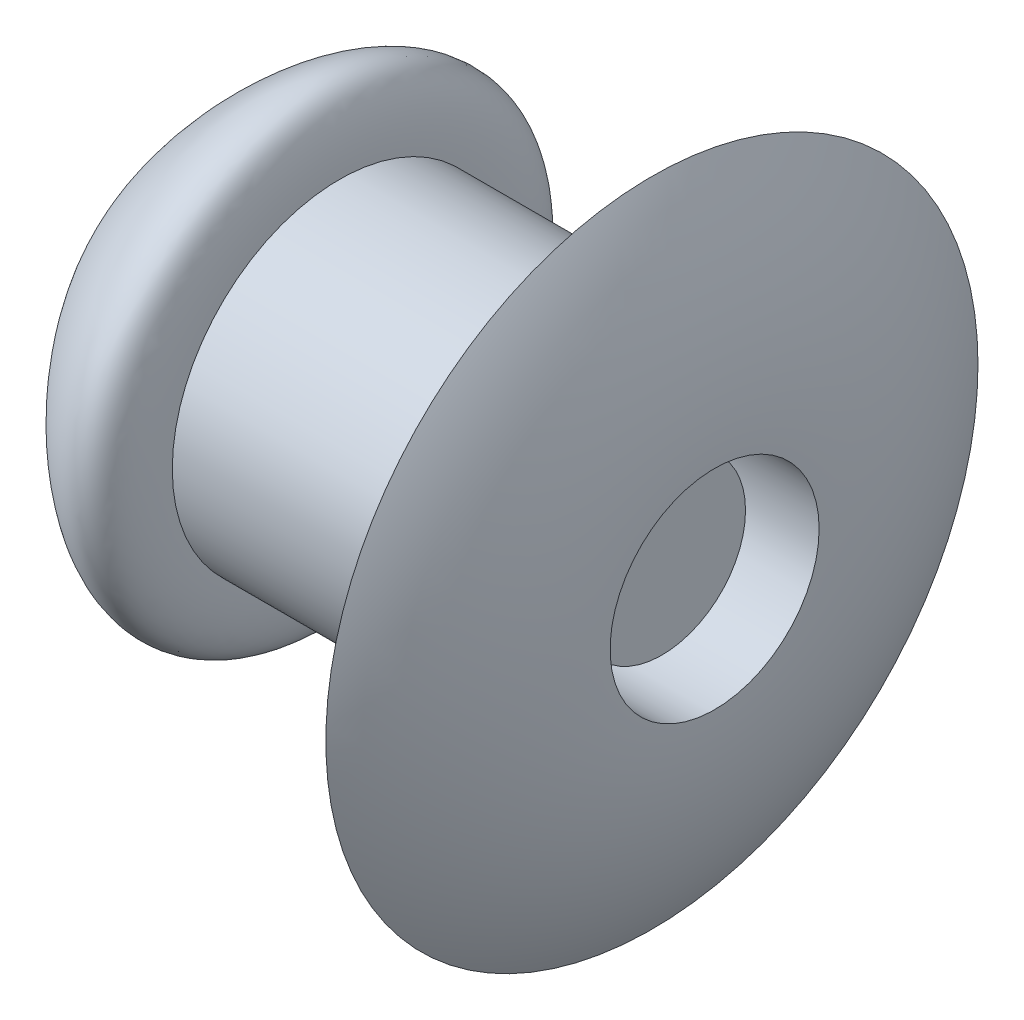
ISO-10303-21;
HEADER;
FILE_DESCRIPTION(('STEP AP214'),'2;1');
FILE_NAME('part.step','',(''),(''),'','','');
FILE_SCHEMA(('AUTOMOTIVE_DESIGN { 1 0 10303 214 1 1 1 1 }'));
ENDSEC;
DATA;
#1=APPLICATION_CONTEXT('core data for automotive mechanical design processes');
#2=APPLICATION_PROTOCOL_DEFINITION('international standard','automotive_design',2000,#1);
#3=PRODUCT_CONTEXT('',#1,'mechanical');
#4=PRODUCT('Part','Part','',(#3));
#5=PRODUCT_RELATED_PRODUCT_CATEGORY('part','',(#4));
#6=PRODUCT_DEFINITION_FORMATION('','',#4);
#7=PRODUCT_DEFINITION_CONTEXT('part definition',#1,'design');
#8=PRODUCT_DEFINITION('design','',#6,#7);
#9=PRODUCT_DEFINITION_SHAPE('','',#8);
#10=(LENGTH_UNIT() NAMED_UNIT(*) SI_UNIT(.MILLI.,.METRE.));
#11=(NAMED_UNIT(*) PLANE_ANGLE_UNIT() SI_UNIT($,.RADIAN.));
#12=(NAMED_UNIT(*) SI_UNIT($,.STERADIAN.) SOLID_ANGLE_UNIT());
#13=UNCERTAINTY_MEASURE_WITH_UNIT(LENGTH_MEASURE(1.E-05),#10,'distance_accuracy_value','');
#14=(GEOMETRIC_REPRESENTATION_CONTEXT(3) GLOBAL_UNCERTAINTY_ASSIGNED_CONTEXT((#13)) GLOBAL_UNIT_ASSIGNED_CONTEXT((#10,
#11,#12)) REPRESENTATION_CONTEXT('',''));
#15=CARTESIAN_POINT('',(0.,0.,0.));
#16=DIRECTION('',(0.,0.,1.));
#17=DIRECTION('',(1.,0.,0.));
#18=AXIS2_PLACEMENT_3D('',#15,#16,#17);
#19=CARTESIAN_POINT('',(346.429933333335,893.681551629297,0.));
#20=DIRECTION('',(1.,0.,0.));
#21=DIRECTION('',(0.,0.,-1.));
#22=AXIS2_PLACEMENT_3D('',#19,#20,#21);
#23=DEGENERATE_TOROIDAL_SURFACE('',#22,1.24999999999997,5.05666666666693,.T.);
#24=CARTESIAN_POINT('',(350.736600000001,893.681551629297,0.));
#25=DIRECTION('',(1.,0.,0.));
#26=DIRECTION('',(0.,0.,-1.));
#27=AXIS2_PLACEMENT_3D('',#24,#25,#26);
#28=CIRCLE('',#27,3.90000000000001);
#29=CARTESIAN_POINT('',(350.736600000001,893.681551629297,-3.90000000000001));
#30=VERTEX_POINT('',#29);
#31=EDGE_CURVE('E11',#30,#30,#28,.T.);
#32=ORIENTED_EDGE('',*,*,#31,.T.);
#33=EDGE_LOOP('',(#32));
#34=FACE_BOUND('',#33,.T.);
#35=CARTESIAN_POINT('',(351.486600000001,893.681551629297,0.));
#36=DIRECTION('',(1.,0.,0.));
#37=DIRECTION('',(0.,0.,-1.));
#38=AXIS2_PLACEMENT_3D('',#35,#36,#37);
#39=CIRCLE('',#38,1.24999999999997);
#40=CARTESIAN_POINT('',(351.486600000001,893.681551629297,-1.24999999999997));
#41=VERTEX_POINT('',#40);
#42=EDGE_CURVE('E84',#41,#41,#39,.T.);
#43=ORIENTED_EDGE('',*,*,#42,.F.);
#44=EDGE_LOOP('',(#43));
#45=FACE_BOUND('',#44,.T.);
#46=ADVANCED_FACE('F33',(#34,#45),#23,.T.);
#47=CARTESIAN_POINT('',(350.736600000001,897.581551629297,0.));
#48=DIRECTION('',(-1.,0.,0.));
#49=DIRECTION('',(0.,0.,1.));
#50=AXIS2_PLACEMENT_3D('',#47,#48,#49);
#51=PLANE('',#50);
#52=CARTESIAN_POINT('',(350.736600000001,893.681551629297,0.));
#53=DIRECTION('',(1.,0.,0.));
#54=DIRECTION('',(0.,0.,-1.));
#55=AXIS2_PLACEMENT_3D('',#52,#53,#54);
#56=CIRCLE('',#55,2.);
#57=CARTESIAN_POINT('',(350.736600000001,893.681551629297,-2.));
#58=VERTEX_POINT('',#57);
#59=EDGE_CURVE('E39',#58,#58,#56,.T.);
#60=ORIENTED_EDGE('',*,*,#59,.T.);
#61=EDGE_LOOP('',(#60));
#62=FACE_BOUND('',#61,.T.);
#63=ORIENTED_EDGE('',*,*,#31,.F.);
#64=EDGE_LOOP('',(#63));
#65=FACE_BOUND('',#64,.T.);
#66=ADVANCED_FACE('F64',(#62,#65),#51,.T.);
#67=CARTESIAN_POINT('',(350.856147885125,893.681551629297,0.));
#68=DIRECTION('',(1.,0.,0.));
#69=DIRECTION('',(0.,0.,-1.));
#70=AXIS2_PLACEMENT_3D('',#67,#68,#69);
#71=CYLINDRICAL_SURFACE('',#70,2.);
#72=CARTESIAN_POINT('',(347.000000013712,893.681551629297,0.));
#73=DIRECTION('',(1.,0.,0.));
#74=DIRECTION('',(0.,0.,-1.));
#75=AXIS2_PLACEMENT_3D('',#72,#73,#74);
#76=CIRCLE('',#75,2.);
#77=CARTESIAN_POINT('',(347.000000013712,893.681551629297,-2.));
#78=VERTEX_POINT('',#77);
#79=EDGE_CURVE('E52',#78,#78,#76,.T.);
#80=ORIENTED_EDGE('',*,*,#79,.T.);
#81=EDGE_LOOP('',(#80));
#82=FACE_BOUND('',#81,.T.);
#83=ORIENTED_EDGE('',*,*,#59,.F.);
#84=EDGE_LOOP('',(#83));
#85=FACE_BOUND('',#84,.T.);
#86=ADVANCED_FACE('F67',(#82,#85),#71,.T.);
#87=CARTESIAN_POINT('',(347.000000013712,895.681551629297,0.));
#88=CARTESIAN_POINT('',(347.036555423588,898.021351685394,0.));
#89=CARTESIAN_POINT('',(343.536594651749,893.309377004903,0.));
#90=CARTESIAN_POINT('',(345.758684651456,895.170148193983,0.));
#91=CARTESIAN_POINT('',(346.055380649424,894.856511413385,0.));
#92=B_SPLINE_CURVE_WITH_KNOTS('',3,(#87,#88,#89,#90,#91),.UNSPECIFIED.,.F.,.F.,(4,1,4),(0.,
0.744501965187623,1.),.UNSPECIFIED.);
#93=CARTESIAN_POINT('',(350.856147885125,893.681551629297,0.));
#94=DIRECTION('',(1.,0.,0.));
#95=AXIS1_PLACEMENT('',#93,#94);
#96=SURFACE_OF_REVOLUTION('',#92,#95);
#97=CARTESIAN_POINT('',(346.055380649424,893.681551629297,0.));
#98=DIRECTION('',(1.,0.,0.));
#99=DIRECTION('',(0.,0.,-1.));
#100=AXIS2_PLACEMENT_3D('',#97,#98,#99);
#101=CIRCLE('',#100,1.17495978408733);
#102=CARTESIAN_POINT('',(346.055380649424,893.681551629297,-1.17495978408733));
#103=VERTEX_POINT('',#102);
#104=EDGE_CURVE('E50',#103,#103,#101,.T.);
#105=ORIENTED_EDGE('',*,*,#104,.T.);
#106=EDGE_LOOP('',(#105));
#107=FACE_BOUND('',#106,.T.);
#108=ORIENTED_EDGE('',*,*,#79,.F.);
#109=EDGE_LOOP('',(#108));
#110=FACE_BOUND('',#109,.T.);
#111=ADVANCED_FACE('F46',(#107,#110),#96,.F.);
#112=CARTESIAN_POINT('',(346.055380649424,894.856511413385,0.));
#113=CARTESIAN_POINT('',(345.173909167695,894.872028364683,0.));
#114=CARTESIAN_POINT('',(345.400000000001,893.681551629297,0.));
#115=B_SPLINE_CURVE_WITH_KNOTS('',2,(#112,#113,#114),.UNSPECIFIED.,.F.,.F.,(3,3),(0.,1.),.UNSPECIFIED.);
#116=CARTESIAN_POINT('',(350.856147885125,893.681551629297,0.));
#117=DIRECTION('',(1.,0.,0.));
#118=AXIS1_PLACEMENT('',#116,#117);
#119=SURFACE_OF_REVOLUTION('',#115,#118);
#120=CARTESIAN_POINT('',(345.400000000001,893.681551629297,0.));
#121=VERTEX_POINT('',#120);
#122=VERTEX_LOOP('',#121);
#123=FACE_BOUND('',#122,.T.);
#124=ORIENTED_EDGE('',*,*,#104,.F.);
#125=EDGE_LOOP('',(#124));
#126=FACE_BOUND('',#125,.T.);
#127=ADVANCED_FACE('F42',(#123,#126),#119,.F.);
#128=CARTESIAN_POINT('',(350.856147885125,894.681551629297,0.));
#129=DIRECTION('',(1.,0.,0.));
#130=DIRECTION('',(0.,0.,-1.));
#131=AXIS2_PLACEMENT_3D('',#128,#129,#130);
#132=PLANE('',#131);
#133=CARTESIAN_POINT('',(350.856147885125,893.681551629297,0.));
#134=DIRECTION('',(1.,0.,0.));
#135=DIRECTION('',(0.,0.,-1.));
#136=AXIS2_PLACEMENT_3D('',#133,#134,#135);
#137=CIRCLE('',#136,0.99999999999989);
#138=CARTESIAN_POINT('',(350.856147885125,893.681551629297,-0.99999999999989));
#139=VERTEX_POINT('',#138);
#140=EDGE_CURVE('E53',#139,#139,#137,.T.);
#141=ORIENTED_EDGE('',*,*,#140,.T.);
#142=EDGE_LOOP('',(#141));
#143=FACE_BOUND('',#142,.T.);
#144=ADVANCED_FACE('F45',(#143),#132,.T.);
#145=CARTESIAN_POINT('',(350.856147885125,893.681551629297,0.));
#146=DIRECTION('',(1.,0.,0.));
#147=DIRECTION('',(0.,0.,-1.));
#148=AXIS2_PLACEMENT_3D('',#145,#146,#147);
#149=CYLINDRICAL_SURFACE('',#148,0.999999999999945);
#150=CARTESIAN_POINT('',(347.000000000002,893.681551629297,0.));
#151=DIRECTION('',(1.,0.,0.));
#152=DIRECTION('',(0.,0.,-1.));
#153=AXIS2_PLACEMENT_3D('',#150,#151,#152);
#154=CIRCLE('',#153,1.);
#155=CARTESIAN_POINT('',(347.000000000002,893.681551629297,-1.));
#156=VERTEX_POINT('',#155);
#157=EDGE_CURVE('E58',#156,#156,#154,.T.);
#158=ORIENTED_EDGE('',*,*,#157,.T.);
#159=EDGE_LOOP('',(#158));
#160=FACE_BOUND('',#159,.T.);
#161=ORIENTED_EDGE('',*,*,#140,.F.);
#162=EDGE_LOOP('',(#161));
#163=FACE_BOUND('',#162,.T.);
#164=ADVANCED_FACE('F98',(#160,#163),#149,.T.);
#165=CARTESIAN_POINT('',(347.000000000002,894.931551629297,0.));
#166=DIRECTION('',(1.,0.,0.));
#167=DIRECTION('',(0.,0.,-1.));
#168=AXIS2_PLACEMENT_3D('',#165,#166,#167);
#169=PLANE('',#168);
#170=CARTESIAN_POINT('',(347.000000000002,893.681551629297,0.));
#171=DIRECTION('',(1.,0.,0.));
#172=DIRECTION('',(0.,0.,-1.));
#173=AXIS2_PLACEMENT_3D('',#170,#171,#172);
#174=CIRCLE('',#173,1.24999999999997);
#175=CARTESIAN_POINT('',(347.000000000002,893.681551629297,-1.24999999999997));
#176=VERTEX_POINT('',#175);
#177=EDGE_CURVE('E86',#176,#176,#174,.T.);
#178=ORIENTED_EDGE('',*,*,#177,.T.);
#179=EDGE_LOOP('',(#178));
#180=FACE_BOUND('',#179,.T.);
#181=ORIENTED_EDGE('',*,*,#157,.F.);
#182=EDGE_LOOP('',(#181));
#183=FACE_BOUND('',#182,.T.);
#184=ADVANCED_FACE('F101',(#180,#183),#169,.T.);
#185=CARTESIAN_POINT('',(350.856147885125,893.681551629297,0.));
#186=DIRECTION('',(1.,0.,0.));
#187=DIRECTION('',(0.,0.,-1.));
#188=AXIS2_PLACEMENT_3D('',#185,#186,#187);
#189=CYLINDRICAL_SURFACE('',#188,1.24999999999997);
#190=ORIENTED_EDGE('',*,*,#42,.T.);
#191=EDGE_LOOP('',(#190));
#192=FACE_BOUND('',#191,.T.);
#193=ORIENTED_EDGE('',*,*,#177,.F.);
#194=EDGE_LOOP('',(#193));
#195=FACE_BOUND('',#194,.T.);
#196=ADVANCED_FACE('F103',(#192,#195),#189,.F.);
#197=CLOSED_SHELL('',(#46,#66,#86,#111,#127,#144,#164,#184,#196));
#198=MANIFOLD_SOLID_BREP('B2',#197);
#199=ADVANCED_BREP_SHAPE_REPRESENTATION('',(#18,#198),#14);
#200=SHAPE_DEFINITION_REPRESENTATION(#9,#199);
ENDSEC;
END-ISO-10303-21;
